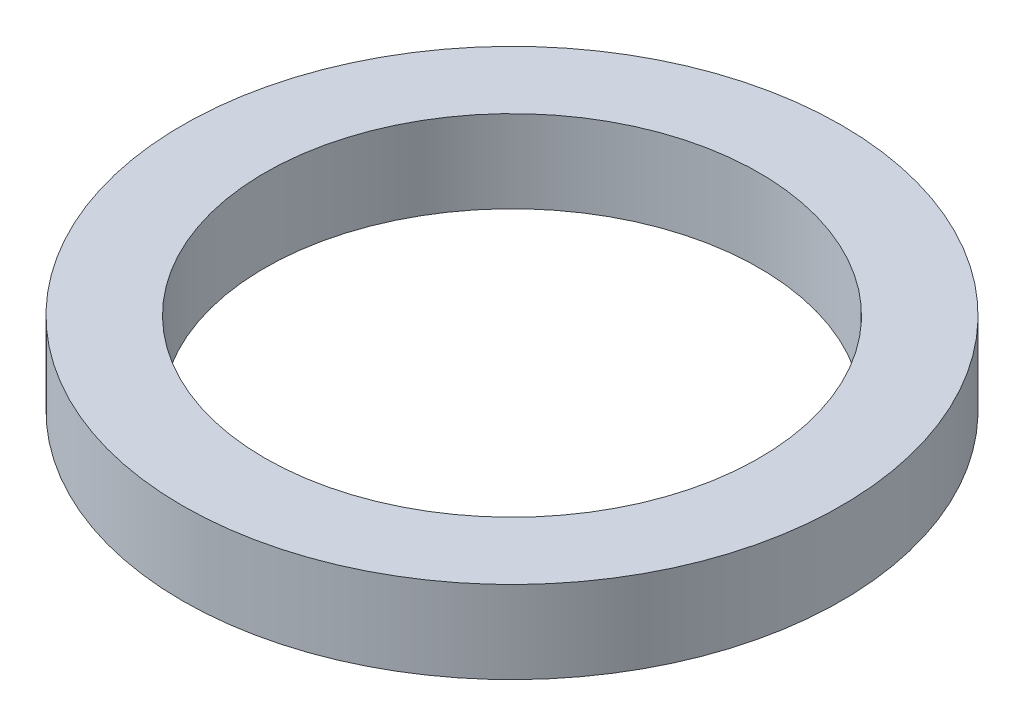
ISO-10303-21;
HEADER;
FILE_DESCRIPTION(('STEP AP214'),'2;1');
FILE_NAME('part.step','',(''),(''),'','','');
FILE_SCHEMA(('AUTOMOTIVE_DESIGN { 1 0 10303 214 1 1 1 1 }'));
ENDSEC;
DATA;
#1=APPLICATION_CONTEXT('core data for automotive mechanical design processes');
#2=APPLICATION_PROTOCOL_DEFINITION('international standard','automotive_design',2000,#1);
#3=PRODUCT_CONTEXT('',#1,'mechanical');
#4=PRODUCT('Part','Part','',(#3));
#5=PRODUCT_RELATED_PRODUCT_CATEGORY('part','',(#4));
#6=PRODUCT_DEFINITION_FORMATION('','',#4);
#7=PRODUCT_DEFINITION_CONTEXT('part definition',#1,'design');
#8=PRODUCT_DEFINITION('design','',#6,#7);
#9=PRODUCT_DEFINITION_SHAPE('','',#8);
#10=(LENGTH_UNIT() NAMED_UNIT(*) SI_UNIT(.MILLI.,.METRE.));
#11=(NAMED_UNIT(*) PLANE_ANGLE_UNIT() SI_UNIT($,.RADIAN.));
#12=(NAMED_UNIT(*) SI_UNIT($,.STERADIAN.) SOLID_ANGLE_UNIT());
#13=UNCERTAINTY_MEASURE_WITH_UNIT(LENGTH_MEASURE(1.E-05),#10,'distance_accuracy_value','');
#14=(GEOMETRIC_REPRESENTATION_CONTEXT(3) GLOBAL_UNCERTAINTY_ASSIGNED_CONTEXT((#13)) GLOBAL_UNIT_ASSIGNED_CONTEXT((#10,
#11,#12)) REPRESENTATION_CONTEXT('',''));
#15=CARTESIAN_POINT('',(0.,0.,0.));
#16=DIRECTION('',(0.,0.,1.));
#17=DIRECTION('',(1.,0.,0.));
#18=AXIS2_PLACEMENT_3D('',#15,#16,#17);
#19=CARTESIAN_POINT('',(0.,3.175,0.));
#20=DIRECTION('',(0.,1.,0.));
#21=DIRECTION('',(0.,0.,1.));
#22=AXIS2_PLACEMENT_3D('',#19,#20,#21);
#23=PLANE('',#22);
#24=CARTESIAN_POINT('',(0.,3.175,0.));
#25=DIRECTION('',(0.,1.,0.));
#26=DIRECTION('',(0.,0.,1.));
#27=AXIS2_PLACEMENT_3D('',#24,#25,#26);
#28=CIRCLE('',#27,12.7);
#29=CARTESIAN_POINT('',(0.,3.175,12.7));
#30=VERTEX_POINT('',#29);
#31=EDGE_CURVE('E11',#30,#30,#28,.T.);
#32=ORIENTED_EDGE('',*,*,#31,.T.);
#33=EDGE_LOOP('',(#32));
#34=FACE_BOUND('',#33,.T.);
#35=CARTESIAN_POINT('',(0.,3.175,0.));
#36=DIRECTION('',(0.,1.,0.));
#37=DIRECTION('',(0.,0.,1.));
#38=AXIS2_PLACEMENT_3D('',#35,#36,#37);
#39=CIRCLE('',#38,9.525);
#40=CARTESIAN_POINT('',(0.,3.175,9.525));
#41=VERTEX_POINT('',#40);
#42=EDGE_CURVE('E48',#41,#41,#39,.T.);
#43=ORIENTED_EDGE('',*,*,#42,.F.);
#44=EDGE_LOOP('',(#43));
#45=FACE_BOUND('',#44,.T.);
#46=ADVANCED_FACE('F37',(#34,#45),#23,.T.);
#47=CARTESIAN_POINT('',(0.,0.,0.));
#48=DIRECTION('',(0.,1.,0.));
#49=DIRECTION('',(0.,0.,1.));
#50=AXIS2_PLACEMENT_3D('',#47,#48,#49);
#51=PLANE('',#50);
#52=CARTESIAN_POINT('',(0.,0.,0.));
#53=DIRECTION('',(0.,1.,0.));
#54=DIRECTION('',(0.,0.,1.));
#55=AXIS2_PLACEMENT_3D('',#52,#53,#54);
#56=CIRCLE('',#55,12.7);
#57=CARTESIAN_POINT('',(0.,0.,12.7));
#58=VERTEX_POINT('',#57);
#59=EDGE_CURVE('E41',#58,#58,#56,.T.);
#60=ORIENTED_EDGE('',*,*,#59,.F.);
#61=EDGE_LOOP('',(#60));
#62=FACE_BOUND('',#61,.T.);
#63=CARTESIAN_POINT('',(0.,0.,0.));
#64=DIRECTION('',(0.,1.,0.));
#65=DIRECTION('',(0.,0.,1.));
#66=AXIS2_PLACEMENT_3D('',#63,#64,#65);
#67=CIRCLE('',#66,9.525);
#68=CARTESIAN_POINT('',(0.,0.,9.525));
#69=VERTEX_POINT('',#68);
#70=EDGE_CURVE('E50',#69,#69,#67,.T.);
#71=ORIENTED_EDGE('',*,*,#70,.T.);
#72=EDGE_LOOP('',(#71));
#73=FACE_BOUND('',#72,.T.);
#74=ADVANCED_FACE('F60',(#62,#73),#51,.F.);
#75=CARTESIAN_POINT('',(0.,3.175,0.));
#76=DIRECTION('',(0.,-1.,0.));
#77=DIRECTION('',(0.,0.,-1.));
#78=AXIS2_PLACEMENT_3D('',#75,#76,#77);
#79=CYLINDRICAL_SURFACE('',#78,12.7);
#80=ORIENTED_EDGE('',*,*,#31,.F.);
#81=EDGE_LOOP('',(#80));
#82=FACE_BOUND('',#81,.T.);
#83=ORIENTED_EDGE('',*,*,#59,.T.);
#84=EDGE_LOOP('',(#83));
#85=FACE_BOUND('',#84,.T.);
#86=ADVANCED_FACE('F39',(#82,#85),#79,.T.);
#87=CARTESIAN_POINT('',(0.,3.175,0.));
#88=DIRECTION('',(0.,-1.,0.));
#89=DIRECTION('',(0.,0.,-1.));
#90=AXIS2_PLACEMENT_3D('',#87,#88,#89);
#91=CYLINDRICAL_SURFACE('',#90,9.525);
#92=ORIENTED_EDGE('',*,*,#42,.T.);
#93=EDGE_LOOP('',(#92));
#94=FACE_BOUND('',#93,.T.);
#95=ORIENTED_EDGE('',*,*,#70,.F.);
#96=EDGE_LOOP('',(#95));
#97=FACE_BOUND('',#96,.T.);
#98=ADVANCED_FACE('F56',(#94,#97),#91,.F.);
#99=CLOSED_SHELL('',(#46,#74,#86,#98));
#100=MANIFOLD_SOLID_BREP('B2',#99);
#101=ADVANCED_BREP_SHAPE_REPRESENTATION('',(#18,#100),#14);
#102=SHAPE_DEFINITION_REPRESENTATION(#9,#101);
ENDSEC;
END-ISO-10303-21;
